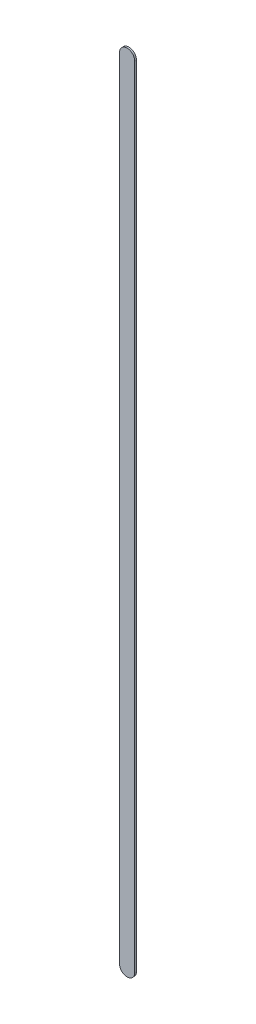
ISO-10303-21;
HEADER;
FILE_DESCRIPTION(('STEP AP214'),'2;1');
FILE_NAME('part.step','',(''),(''),'','','');
FILE_SCHEMA(('AUTOMOTIVE_DESIGN { 1 0 10303 214 1 1 1 1 }'));
ENDSEC;
DATA;
#1=APPLICATION_CONTEXT('core data for automotive mechanical design processes');
#2=APPLICATION_PROTOCOL_DEFINITION('international standard','automotive_design',2000,#1);
#3=PRODUCT_CONTEXT('',#1,'mechanical');
#4=PRODUCT('Part','Part','',(#3));
#5=PRODUCT_RELATED_PRODUCT_CATEGORY('part','',(#4));
#6=PRODUCT_DEFINITION_FORMATION('','',#4);
#7=PRODUCT_DEFINITION_CONTEXT('part definition',#1,'design');
#8=PRODUCT_DEFINITION('design','',#6,#7);
#9=PRODUCT_DEFINITION_SHAPE('','',#8);
#10=(LENGTH_UNIT() NAMED_UNIT(*) SI_UNIT(.MILLI.,.METRE.));
#11=(NAMED_UNIT(*) PLANE_ANGLE_UNIT() SI_UNIT($,.RADIAN.));
#12=(NAMED_UNIT(*) SI_UNIT($,.STERADIAN.) SOLID_ANGLE_UNIT());
#13=UNCERTAINTY_MEASURE_WITH_UNIT(LENGTH_MEASURE(1.E-05),#10,'distance_accuracy_value','');
#14=(GEOMETRIC_REPRESENTATION_CONTEXT(3) GLOBAL_UNCERTAINTY_ASSIGNED_CONTEXT((#13)) GLOBAL_UNIT_ASSIGNED_CONTEXT((#10,
#11,#12)) REPRESENTATION_CONTEXT('',''));
#15=CARTESIAN_POINT('',(0.,0.,0.));
#16=DIRECTION('',(0.,0.,1.));
#17=DIRECTION('',(1.,0.,0.));
#18=AXIS2_PLACEMENT_3D('',#15,#16,#17);
#19=CARTESIAN_POINT('',(76.1,-93.05,1.635));
#20=DIRECTION('',(0.,0.,1.));
#21=DIRECTION('',(1.,0.,0.));
#22=AXIS2_PLACEMENT_3D('',#19,#20,#21);
#23=PLANE('',#22);
#24=DIRECTION('',(0.,-1.,0.));
#25=VECTOR('',#24,1.);
#26=CARTESIAN_POINT('',(76.1,-93.05,1.635));
#27=LINE('',#26,#25);
#28=CARTESIAN_POINT('',(76.1,-93.05,1.635));
#29=VERTEX_POINT('',#28);
#30=CARTESIAN_POINT('',(76.1,-108.62,1.635));
#31=VERTEX_POINT('',#30);
#32=EDGE_CURVE('E68',#29,#31,#27,.T.);
#33=ORIENTED_EDGE('',*,*,#32,.T.);
#34=CARTESIAN_POINT('',(76.25,-108.62,1.635));
#35=DIRECTION('',(0.,0.,1.));
#36=DIRECTION('',(-1.,0.,0.));
#37=AXIS2_PLACEMENT_3D('',#34,#35,#36);
#38=CIRCLE('',#37,0.15);
#39=CARTESIAN_POINT('',(76.4,-108.62,1.635));
#40=VERTEX_POINT('',#39);
#41=EDGE_CURVE('E92',#31,#40,#38,.T.);
#42=ORIENTED_EDGE('',*,*,#41,.T.);
#43=DIRECTION('',(0.,1.,0.));
#44=VECTOR('',#43,1.);
#45=CARTESIAN_POINT('',(76.4,-108.62,1.635));
#46=LINE('',#45,#44);
#47=CARTESIAN_POINT('',(76.4,-93.05,1.635));
#48=VERTEX_POINT('',#47);
#49=EDGE_CURVE('E20',#40,#48,#46,.T.);
#50=ORIENTED_EDGE('',*,*,#49,.T.);
#51=CARTESIAN_POINT('',(76.25,-93.05,1.635));
#52=DIRECTION('',(0.,0.,1.));
#53=DIRECTION('',(1.,0.,0.));
#54=AXIS2_PLACEMENT_3D('',#51,#52,#53);
#55=CIRCLE('',#54,0.15);
#56=EDGE_CURVE('E11',#48,#29,#55,.T.);
#57=ORIENTED_EDGE('',*,*,#56,.T.);
#58=EDGE_LOOP('',(#33,#42,#50,#57));
#59=FACE_BOUND('',#58,.T.);
#60=ADVANCED_FACE('F17',(#59),#23,.T.);
#61=CARTESIAN_POINT('',(76.1,-93.05,1.6));
#62=DIRECTION('',(0.,0.,1.));
#63=DIRECTION('',(1.,0.,0.));
#64=AXIS2_PLACEMENT_3D('',#61,#62,#63);
#65=PLANE('',#64);
#66=CARTESIAN_POINT('',(76.25,-93.05,1.6));
#67=DIRECTION('',(0.,0.,1.));
#68=DIRECTION('',(1.,0.,0.));
#69=AXIS2_PLACEMENT_3D('',#66,#67,#68);
#70=CIRCLE('',#69,0.15);
#71=CARTESIAN_POINT('',(76.4,-93.05,1.6));
#72=VERTEX_POINT('',#71);
#73=CARTESIAN_POINT('',(76.1,-93.05,1.6));
#74=VERTEX_POINT('',#73);
#75=EDGE_CURVE('E27',#72,#74,#70,.T.);
#76=ORIENTED_EDGE('',*,*,#75,.F.);
#77=DIRECTION('',(0.,1.,0.));
#78=VECTOR('',#77,1.);
#79=CARTESIAN_POINT('',(76.4,-108.62,1.6));
#80=LINE('',#79,#78);
#81=CARTESIAN_POINT('',(76.4,-108.62,1.6));
#82=VERTEX_POINT('',#81);
#83=EDGE_CURVE('E103',#82,#72,#80,.T.);
#84=ORIENTED_EDGE('',*,*,#83,.F.);
#85=CARTESIAN_POINT('',(76.25,-108.62,1.6));
#86=DIRECTION('',(0.,0.,1.));
#87=DIRECTION('',(-1.,0.,0.));
#88=AXIS2_PLACEMENT_3D('',#85,#86,#87);
#89=CIRCLE('',#88,0.15);
#90=CARTESIAN_POINT('',(76.1,-108.62,1.6));
#91=VERTEX_POINT('',#90);
#92=EDGE_CURVE('E78',#91,#82,#89,.T.);
#93=ORIENTED_EDGE('',*,*,#92,.F.);
#94=DIRECTION('',(0.,-1.,0.));
#95=VECTOR('',#94,1.);
#96=CARTESIAN_POINT('',(76.1,-93.05,1.6));
#97=LINE('',#96,#95);
#98=EDGE_CURVE('E89',#74,#91,#97,.T.);
#99=ORIENTED_EDGE('',*,*,#98,.F.);
#100=EDGE_LOOP('',(#76,#84,#93,#99));
#101=FACE_BOUND('',#100,.T.);
#102=ADVANCED_FACE('F159',(#101),#65,.F.);
#103=CARTESIAN_POINT('',(76.25,-93.05,1.6));
#104=DIRECTION('',(0.,0.,-1.));
#105=DIRECTION('',(1.,0.,0.));
#106=AXIS2_PLACEMENT_3D('',#103,#104,#105);
#107=CYLINDRICAL_SURFACE('',#106,0.15);
#108=ORIENTED_EDGE('',*,*,#75,.T.);
#109=DIRECTION('',(0.,0.,1.));
#110=VECTOR('',#109,1.);
#111=CARTESIAN_POINT('',(76.1,-93.05,1.6));
#112=LINE('',#111,#110);
#113=EDGE_CURVE('E72',#74,#29,#112,.T.);
#114=ORIENTED_EDGE('',*,*,#113,.T.);
#115=ORIENTED_EDGE('',*,*,#56,.F.);
#116=DIRECTION('',(0.,0.,1.));
#117=VECTOR('',#116,1.);
#118=CARTESIAN_POINT('',(76.4,-93.05,1.6));
#119=LINE('',#118,#117);
#120=EDGE_CURVE('E106',#72,#48,#119,.T.);
#121=ORIENTED_EDGE('',*,*,#120,.F.);
#122=EDGE_LOOP('',(#108,#114,#115,#121));
#123=FACE_BOUND('',#122,.T.);
#124=ADVANCED_FACE('F73',(#123),#107,.T.);
#125=CARTESIAN_POINT('',(76.4,-108.62,1.6));
#126=DIRECTION('',(-1.,0.,0.));
#127=DIRECTION('',(0.,0.,1.));
#128=AXIS2_PLACEMENT_3D('',#125,#126,#127);
#129=PLANE('',#128);
#130=ORIENTED_EDGE('',*,*,#83,.T.);
#131=ORIENTED_EDGE('',*,*,#120,.T.);
#132=ORIENTED_EDGE('',*,*,#49,.F.);
#133=DIRECTION('',(0.,0.,1.));
#134=VECTOR('',#133,1.);
#135=CARTESIAN_POINT('',(76.4,-108.62,1.6));
#136=LINE('',#135,#134);
#137=EDGE_CURVE('E97',#82,#40,#136,.T.);
#138=ORIENTED_EDGE('',*,*,#137,.F.);
#139=EDGE_LOOP('',(#130,#131,#132,#138));
#140=FACE_BOUND('',#139,.T.);
#141=ADVANCED_FACE('F141',(#140),#129,.F.);
#142=CARTESIAN_POINT('',(76.25,-108.62,1.6));
#143=DIRECTION('',(0.,0.,-1.));
#144=DIRECTION('',(-1.,0.,0.));
#145=AXIS2_PLACEMENT_3D('',#142,#143,#144);
#146=CYLINDRICAL_SURFACE('',#145,0.15);
#147=ORIENTED_EDGE('',*,*,#92,.T.);
#148=ORIENTED_EDGE('',*,*,#137,.T.);
#149=ORIENTED_EDGE('',*,*,#41,.F.);
#150=DIRECTION('',(0.,0.,1.));
#151=VECTOR('',#150,1.);
#152=CARTESIAN_POINT('',(76.1,-108.62,1.6));
#153=LINE('',#152,#151);
#154=EDGE_CURVE('E82',#91,#31,#153,.T.);
#155=ORIENTED_EDGE('',*,*,#154,.F.);
#156=EDGE_LOOP('',(#147,#148,#149,#155));
#157=FACE_BOUND('',#156,.T.);
#158=ADVANCED_FACE('F131',(#157),#146,.T.);
#159=CARTESIAN_POINT('',(76.1,-93.05,1.6));
#160=DIRECTION('',(1.,0.,0.));
#161=DIRECTION('',(0.,1.,0.));
#162=AXIS2_PLACEMENT_3D('',#159,#160,#161);
#163=PLANE('',#162);
#164=ORIENTED_EDGE('',*,*,#98,.T.);
#165=ORIENTED_EDGE('',*,*,#154,.T.);
#166=ORIENTED_EDGE('',*,*,#32,.F.);
#167=ORIENTED_EDGE('',*,*,#113,.F.);
#168=EDGE_LOOP('',(#164,#165,#166,#167));
#169=FACE_BOUND('',#168,.T.);
#170=ADVANCED_FACE('F80',(#169),#163,.F.);
#171=CLOSED_SHELL('',(#60,#102,#124,#141,#158,#170));
#172=MANIFOLD_SOLID_BREP('B1',#171);
#173=ADVANCED_BREP_SHAPE_REPRESENTATION('',(#18,#172),#14);
#174=SHAPE_DEFINITION_REPRESENTATION(#9,#173);
ENDSEC;
END-ISO-10303-21;
